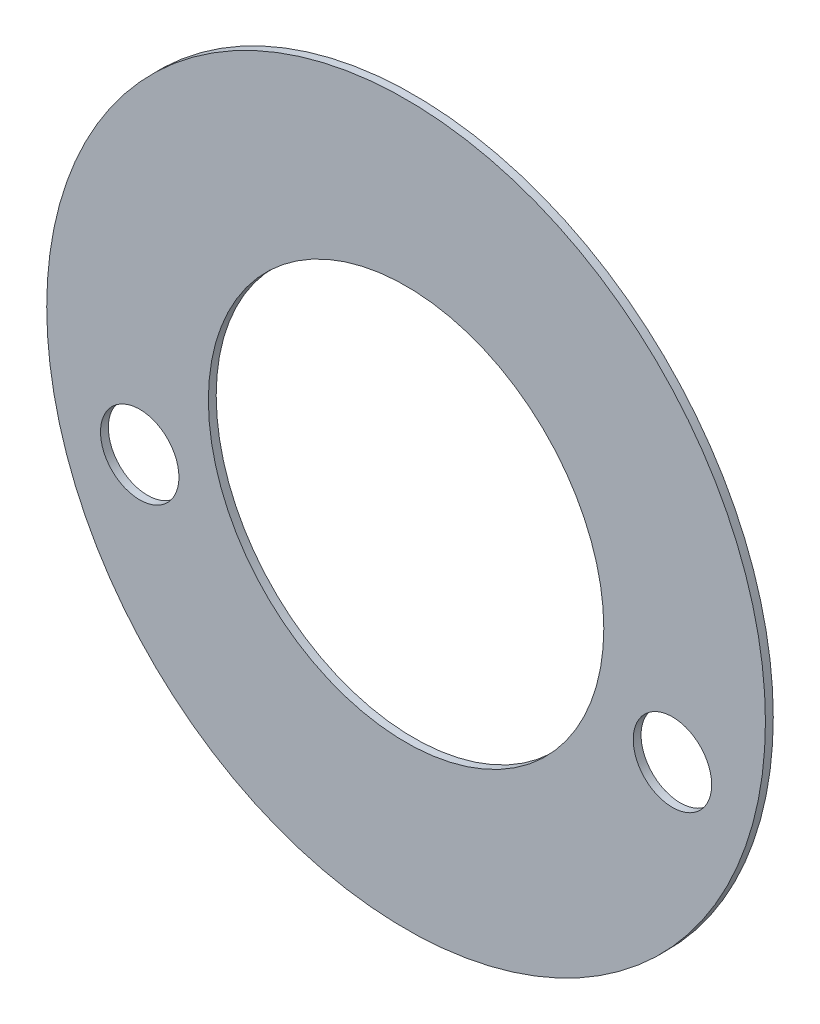
ISO-10303-21;
HEADER;
FILE_DESCRIPTION(('STEP AP214'),'2;1');
FILE_NAME('part.step','',(''),(''),'','','');
FILE_SCHEMA(('AUTOMOTIVE_DESIGN { 1 0 10303 214 1 1 1 1 }'));
ENDSEC;
DATA;
#1=APPLICATION_CONTEXT('core data for automotive mechanical design processes');
#2=APPLICATION_PROTOCOL_DEFINITION('international standard','automotive_design',2000,#1);
#3=PRODUCT_CONTEXT('',#1,'mechanical');
#4=PRODUCT('Part','Part','',(#3));
#5=PRODUCT_RELATED_PRODUCT_CATEGORY('part','',(#4));
#6=PRODUCT_DEFINITION_FORMATION('','',#4);
#7=PRODUCT_DEFINITION_CONTEXT('part definition',#1,'design');
#8=PRODUCT_DEFINITION('design','',#6,#7);
#9=PRODUCT_DEFINITION_SHAPE('','',#8);
#10=(LENGTH_UNIT() NAMED_UNIT(*) SI_UNIT(.MILLI.,.METRE.));
#11=(NAMED_UNIT(*) PLANE_ANGLE_UNIT() SI_UNIT($,.RADIAN.));
#12=(NAMED_UNIT(*) SI_UNIT($,.STERADIAN.) SOLID_ANGLE_UNIT());
#13=UNCERTAINTY_MEASURE_WITH_UNIT(LENGTH_MEASURE(1.E-05),#10,'distance_accuracy_value','');
#14=(GEOMETRIC_REPRESENTATION_CONTEXT(3) GLOBAL_UNCERTAINTY_ASSIGNED_CONTEXT((#13)) GLOBAL_UNIT_ASSIGNED_CONTEXT((#10,
#11,#12)) REPRESENTATION_CONTEXT('',''));
#15=CARTESIAN_POINT('',(0.,0.,0.));
#16=DIRECTION('',(0.,0.,1.));
#17=DIRECTION('',(1.,0.,0.));
#18=AXIS2_PLACEMENT_3D('',#15,#16,#17);
#19=CARTESIAN_POINT('',(0.,0.,0.5));
#20=DIRECTION('',(0.,0.,1.));
#21=DIRECTION('',(1.,0.,0.));
#22=AXIS2_PLACEMENT_3D('',#19,#20,#21);
#23=PLANE('',#22);
#24=CARTESIAN_POINT('',(-16.973503404136,-5.19256027310071,0.5));
#25=DIRECTION('',(0.,0.,1.));
#26=DIRECTION('',(1.,0.,0.));
#27=AXIS2_PLACEMENT_3D('',#24,#25,#26);
#28=CIRCLE('',#27,2.5);
#29=CARTESIAN_POINT('',(-14.473503404136,-5.19256027310071,0.5));
#30=VERTEX_POINT('',#29);
#31=EDGE_CURVE('E56',#30,#30,#28,.T.);
#32=ORIENTED_EDGE('',*,*,#31,.F.);
#33=EDGE_LOOP('',(#32));
#34=FACE_BOUND('',#33,.T.);
#35=CARTESIAN_POINT('',(0.,0.,0.5));
#36=DIRECTION('',(0.,0.,1.));
#37=DIRECTION('',(1.,0.,0.));
#38=AXIS2_PLACEMENT_3D('',#35,#36,#37);
#39=CIRCLE('',#38,22.9);
#40=CARTESIAN_POINT('',(22.9,0.,0.5));
#41=VERTEX_POINT('',#40);
#42=EDGE_CURVE('E10',#41,#41,#39,.T.);
#43=ORIENTED_EDGE('',*,*,#42,.T.);
#44=EDGE_LOOP('',(#43));
#45=FACE_BOUND('',#44,.T.);
#46=CARTESIAN_POINT('',(0.,0.,0.5));
#47=DIRECTION('',(0.,0.,1.));
#48=DIRECTION('',(1.,0.,0.));
#49=AXIS2_PLACEMENT_3D('',#46,#47,#48);
#50=CIRCLE('',#49,12.6);
#51=CARTESIAN_POINT('',(12.6,0.,0.5));
#52=VERTEX_POINT('',#51);
#53=EDGE_CURVE('E50',#52,#52,#50,.T.);
#54=ORIENTED_EDGE('',*,*,#53,.F.);
#55=EDGE_LOOP('',(#54));
#56=FACE_BOUND('',#55,.T.);
#57=CARTESIAN_POINT('',(16.973503404136,-5.19256027310071,0.5));
#58=DIRECTION('',(0.,0.,1.));
#59=DIRECTION('',(1.,0.,0.));
#60=AXIS2_PLACEMENT_3D('',#57,#58,#59);
#61=CIRCLE('',#60,2.5);
#62=CARTESIAN_POINT('',(19.473503404136,-5.19256027310071,0.5));
#63=VERTEX_POINT('',#62);
#64=EDGE_CURVE('E64',#63,#63,#61,.T.);
#65=ORIENTED_EDGE('',*,*,#64,.F.);
#66=EDGE_LOOP('',(#65));
#67=FACE_BOUND('',#66,.T.);
#68=ADVANCED_FACE('F37',(#34,#45,#56,#67),#23,.T.);
#69=CARTESIAN_POINT('',(0.,0.,0.));
#70=DIRECTION('',(0.,0.,1.));
#71=DIRECTION('',(1.,0.,0.));
#72=AXIS2_PLACEMENT_3D('',#69,#70,#71);
#73=PLANE('',#72);
#74=CARTESIAN_POINT('',(0.,0.,0.));
#75=DIRECTION('',(0.,0.,1.));
#76=DIRECTION('',(1.,0.,0.));
#77=AXIS2_PLACEMENT_3D('',#74,#75,#76);
#78=CIRCLE('',#77,22.9);
#79=CARTESIAN_POINT('',(22.9,0.,0.));
#80=VERTEX_POINT('',#79);
#81=EDGE_CURVE('E41',#80,#80,#78,.T.);
#82=ORIENTED_EDGE('',*,*,#81,.F.);
#83=EDGE_LOOP('',(#82));
#84=FACE_BOUND('',#83,.T.);
#85=CARTESIAN_POINT('',(0.,0.,0.));
#86=DIRECTION('',(0.,0.,1.));
#87=DIRECTION('',(1.,0.,0.));
#88=AXIS2_PLACEMENT_3D('',#85,#86,#87);
#89=CIRCLE('',#88,12.6);
#90=CARTESIAN_POINT('',(12.6,0.,0.));
#91=VERTEX_POINT('',#90);
#92=EDGE_CURVE('E52',#91,#91,#89,.T.);
#93=ORIENTED_EDGE('',*,*,#92,.T.);
#94=EDGE_LOOP('',(#93));
#95=FACE_BOUND('',#94,.T.);
#96=CARTESIAN_POINT('',(-16.973503404136,-5.19256027310071,0.));
#97=DIRECTION('',(0.,0.,1.));
#98=DIRECTION('',(1.,0.,0.));
#99=AXIS2_PLACEMENT_3D('',#96,#97,#98);
#100=CIRCLE('',#99,2.5);
#101=CARTESIAN_POINT('',(-14.473503404136,-5.19256027310071,0.));
#102=VERTEX_POINT('',#101);
#103=EDGE_CURVE('E60',#102,#102,#100,.T.);
#104=ORIENTED_EDGE('',*,*,#103,.T.);
#105=EDGE_LOOP('',(#104));
#106=FACE_BOUND('',#105,.T.);
#107=CARTESIAN_POINT('',(16.973503404136,-5.19256027310071,0.));
#108=DIRECTION('',(0.,0.,1.));
#109=DIRECTION('',(1.,0.,0.));
#110=AXIS2_PLACEMENT_3D('',#107,#108,#109);
#111=CIRCLE('',#110,2.5);
#112=CARTESIAN_POINT('',(19.473503404136,-5.19256027310071,0.));
#113=VERTEX_POINT('',#112);
#114=EDGE_CURVE('E68',#113,#113,#111,.T.);
#115=ORIENTED_EDGE('',*,*,#114,.T.);
#116=EDGE_LOOP('',(#115));
#117=FACE_BOUND('',#116,.T.);
#118=ADVANCED_FACE('F80',(#84,#95,#106,#117),#73,.F.);
#119=CARTESIAN_POINT('',(0.,0.,0.5));
#120=DIRECTION('',(0.,0.,-1.));
#121=DIRECTION('',(-1.,0.,0.));
#122=AXIS2_PLACEMENT_3D('',#119,#120,#121);
#123=CYLINDRICAL_SURFACE('',#122,22.9);
#124=ORIENTED_EDGE('',*,*,#42,.F.);
#125=EDGE_LOOP('',(#124));
#126=FACE_BOUND('',#125,.T.);
#127=ORIENTED_EDGE('',*,*,#81,.T.);
#128=EDGE_LOOP('',(#127));
#129=FACE_BOUND('',#128,.T.);
#130=ADVANCED_FACE('F39',(#126,#129),#123,.T.);
#131=CARTESIAN_POINT('',(0.,0.,0.5));
#132=DIRECTION('',(0.,0.,-1.));
#133=DIRECTION('',(-1.,0.,0.));
#134=AXIS2_PLACEMENT_3D('',#131,#132,#133);
#135=CYLINDRICAL_SURFACE('',#134,12.6);
#136=ORIENTED_EDGE('',*,*,#53,.T.);
#137=EDGE_LOOP('',(#136));
#138=FACE_BOUND('',#137,.T.);
#139=ORIENTED_EDGE('',*,*,#92,.F.);
#140=EDGE_LOOP('',(#139));
#141=FACE_BOUND('',#140,.T.);
#142=ADVANCED_FACE('F89',(#138,#141),#135,.F.);
#143=CARTESIAN_POINT('',(-16.973503404136,-5.19256027310071,0.5));
#144=DIRECTION('',(0.,0.,-1.));
#145=DIRECTION('',(-1.,0.,0.));
#146=AXIS2_PLACEMENT_3D('',#143,#144,#145);
#147=CYLINDRICAL_SURFACE('',#146,2.5);
#148=ORIENTED_EDGE('',*,*,#31,.T.);
#149=EDGE_LOOP('',(#148));
#150=FACE_BOUND('',#149,.T.);
#151=ORIENTED_EDGE('',*,*,#103,.F.);
#152=EDGE_LOOP('',(#151));
#153=FACE_BOUND('',#152,.T.);
#154=ADVANCED_FACE('F92',(#150,#153),#147,.F.);
#155=CARTESIAN_POINT('',(16.973503404136,-5.19256027310071,0.5));
#156=DIRECTION('',(0.,0.,-1.));
#157=DIRECTION('',(-1.,0.,0.));
#158=AXIS2_PLACEMENT_3D('',#155,#156,#157);
#159=CYLINDRICAL_SURFACE('',#158,2.5);
#160=ORIENTED_EDGE('',*,*,#64,.T.);
#161=EDGE_LOOP('',(#160));
#162=FACE_BOUND('',#161,.T.);
#163=ORIENTED_EDGE('',*,*,#114,.F.);
#164=EDGE_LOOP('',(#163));
#165=FACE_BOUND('',#164,.T.);
#166=ADVANCED_FACE('F76',(#162,#165),#159,.F.);
#167=CLOSED_SHELL('',(#68,#118,#130,#142,#154,#166));
#168=MANIFOLD_SOLID_BREP('B2',#167);
#169=ADVANCED_BREP_SHAPE_REPRESENTATION('',(#18,#168),#14);
#170=SHAPE_DEFINITION_REPRESENTATION(#9,#169);
ENDSEC;
END-ISO-10303-21;
